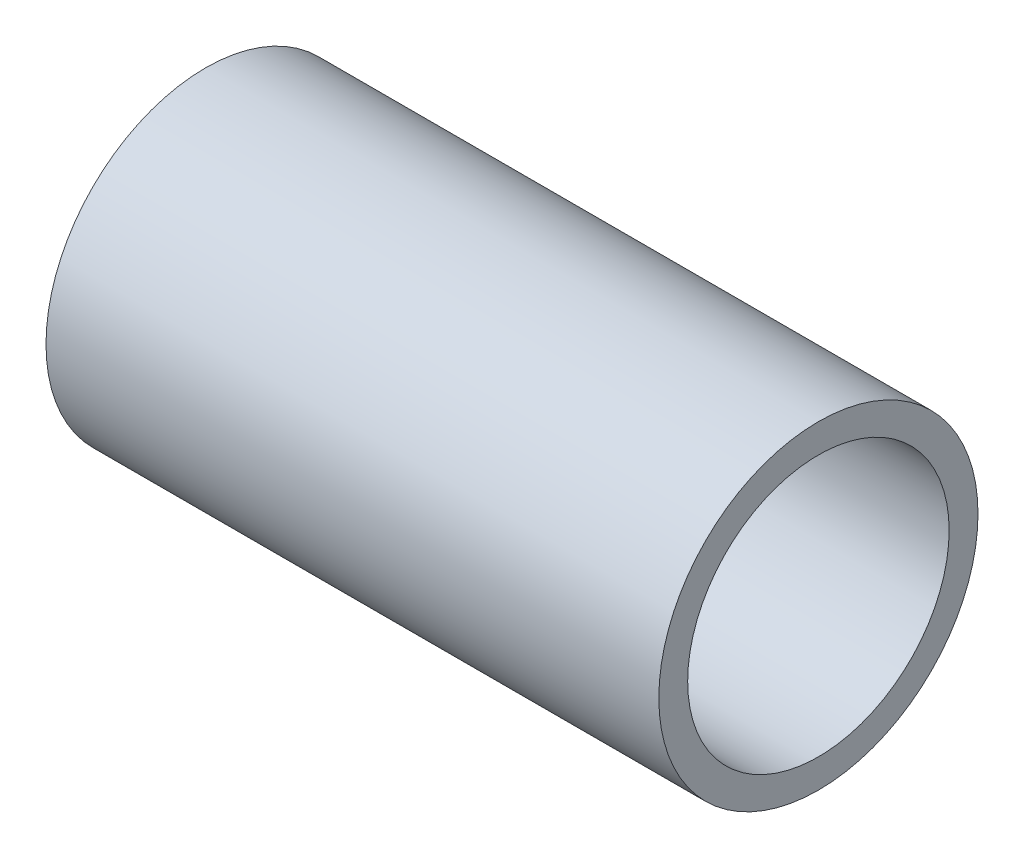
ISO-10303-21;
HEADER;
FILE_DESCRIPTION(('STEP AP214'),'2;1');
FILE_NAME('part.step','',(''),(''),'','','');
FILE_SCHEMA(('AUTOMOTIVE_DESIGN { 1 0 10303 214 1 1 1 1 }'));
ENDSEC;
DATA;
#1=APPLICATION_CONTEXT('core data for automotive mechanical design processes');
#2=APPLICATION_PROTOCOL_DEFINITION('international standard','automotive_design',2000,#1);
#3=PRODUCT_CONTEXT('',#1,'mechanical');
#4=PRODUCT('Part','Part','',(#3));
#5=PRODUCT_RELATED_PRODUCT_CATEGORY('part','',(#4));
#6=PRODUCT_DEFINITION_FORMATION('','',#4);
#7=PRODUCT_DEFINITION_CONTEXT('part definition',#1,'design');
#8=PRODUCT_DEFINITION('design','',#6,#7);
#9=PRODUCT_DEFINITION_SHAPE('','',#8);
#10=(LENGTH_UNIT() NAMED_UNIT(*) SI_UNIT(.MILLI.,.METRE.));
#11=(NAMED_UNIT(*) PLANE_ANGLE_UNIT() SI_UNIT($,.RADIAN.));
#12=(NAMED_UNIT(*) SI_UNIT($,.STERADIAN.) SOLID_ANGLE_UNIT());
#13=UNCERTAINTY_MEASURE_WITH_UNIT(LENGTH_MEASURE(1.E-05),#10,'distance_accuracy_value','');
#14=(GEOMETRIC_REPRESENTATION_CONTEXT(3) GLOBAL_UNCERTAINTY_ASSIGNED_CONTEXT((#13)) GLOBAL_UNIT_ASSIGNED_CONTEXT((#10,
#11,#12)) REPRESENTATION_CONTEXT('',''));
#15=CARTESIAN_POINT('',(0.,0.,0.));
#16=DIRECTION('',(0.,0.,1.));
#17=DIRECTION('',(1.,0.,0.));
#18=AXIS2_PLACEMENT_3D('',#15,#16,#17);
#19=CARTESIAN_POINT('',(7.62,0.,0.));
#20=DIRECTION('',(1.,0.,0.));
#21=DIRECTION('',(0.,0.,-1.));
#22=AXIS2_PLACEMENT_3D('',#19,#20,#21);
#23=PLANE('',#22);
#24=CARTESIAN_POINT('',(7.62,0.,0.));
#25=DIRECTION('',(1.,0.,0.));
#26=DIRECTION('',(0.,0.,-1.));
#27=AXIS2_PLACEMENT_3D('',#24,#25,#26);
#28=CIRCLE('',#27,1.984375);
#29=CARTESIAN_POINT('',(7.62,0.,1.984375));
#30=VERTEX_POINT('',#29);
#31=EDGE_CURVE('E10',#30,#30,#28,.T.);
#32=ORIENTED_EDGE('',*,*,#31,.T.);
#33=EDGE_LOOP('',(#32));
#34=FACE_BOUND('',#33,.T.);
#35=CARTESIAN_POINT('',(7.62,0.,0.));
#36=DIRECTION('',(1.,0.,0.));
#37=DIRECTION('',(0.,0.,-1.));
#38=AXIS2_PLACEMENT_3D('',#35,#36,#37);
#39=CIRCLE('',#38,1.6256);
#40=CARTESIAN_POINT('',(7.62,0.,1.6256));
#41=VERTEX_POINT('',#40);
#42=EDGE_CURVE('E46',#41,#41,#39,.T.);
#43=ORIENTED_EDGE('',*,*,#42,.F.);
#44=EDGE_LOOP('',(#43));
#45=FACE_BOUND('',#44,.T.);
#46=ADVANCED_FACE('F35',(#34,#45),#23,.T.);
#47=CARTESIAN_POINT('',(0.,0.,0.));
#48=DIRECTION('',(1.,0.,0.));
#49=DIRECTION('',(0.,0.,-1.));
#50=AXIS2_PLACEMENT_3D('',#47,#48,#49);
#51=PLANE('',#50);
#52=CARTESIAN_POINT('',(0.,0.,0.));
#53=DIRECTION('',(1.,0.,0.));
#54=DIRECTION('',(0.,0.,-1.));
#55=AXIS2_PLACEMENT_3D('',#52,#53,#54);
#56=CIRCLE('',#55,1.984375);
#57=CARTESIAN_POINT('',(0.,0.,1.984375));
#58=VERTEX_POINT('',#57);
#59=EDGE_CURVE('E39',#58,#58,#56,.T.);
#60=ORIENTED_EDGE('',*,*,#59,.F.);
#61=EDGE_LOOP('',(#60));
#62=FACE_BOUND('',#61,.T.);
#63=CARTESIAN_POINT('',(0.,0.,0.));
#64=DIRECTION('',(1.,0.,0.));
#65=DIRECTION('',(0.,0.,-1.));
#66=AXIS2_PLACEMENT_3D('',#63,#64,#65);
#67=CIRCLE('',#66,1.6256);
#68=CARTESIAN_POINT('',(0.,0.,1.6256));
#69=VERTEX_POINT('',#68);
#70=EDGE_CURVE('E48',#69,#69,#67,.T.);
#71=ORIENTED_EDGE('',*,*,#70,.T.);
#72=EDGE_LOOP('',(#71));
#73=FACE_BOUND('',#72,.T.);
#74=ADVANCED_FACE('F58',(#62,#73),#51,.F.);
#75=CARTESIAN_POINT('',(7.62,0.,0.));
#76=DIRECTION('',(-1.,0.,0.));
#77=DIRECTION('',(0.,0.,1.));
#78=AXIS2_PLACEMENT_3D('',#75,#76,#77);
#79=CYLINDRICAL_SURFACE('',#78,1.984375);
#80=CARTESIAN_POINT('',(7.62,0.,1.984375));
#81=CARTESIAN_POINT('',(7.540625,0.,1.984375));
#82=CARTESIAN_POINT('',(7.46125,0.,1.984375));
#83=CARTESIAN_POINT('',(7.3025,0.,1.984375));
#84=CARTESIAN_POINT('',(7.223125,0.,1.984375));
#85=CARTESIAN_POINT('',(7.064375,0.,1.984375));
#86=CARTESIAN_POINT('',(6.985,0.,1.984375));
#87=CARTESIAN_POINT('',(6.82625,0.,1.984375));
#88=CARTESIAN_POINT('',(6.746875,0.,1.984375));
#89=CARTESIAN_POINT('',(6.588125,0.,1.984375));
#90=CARTESIAN_POINT('',(6.50875,0.,1.984375));
#91=CARTESIAN_POINT('',(6.35,0.,1.984375));
#92=CARTESIAN_POINT('',(6.270625,0.,1.984375));
#93=CARTESIAN_POINT('',(6.111875,0.,1.984375));
#94=CARTESIAN_POINT('',(6.0325,0.,1.984375));
#95=CARTESIAN_POINT('',(5.87375,0.,1.984375));
#96=CARTESIAN_POINT('',(5.794375,0.,1.984375));
#97=CARTESIAN_POINT('',(5.635625,0.,1.984375));
#98=CARTESIAN_POINT('',(5.55625,0.,1.984375));
#99=CARTESIAN_POINT('',(5.3975,0.,1.984375));
#100=CARTESIAN_POINT('',(5.318125,0.,1.984375));
#101=CARTESIAN_POINT('',(5.159375,0.,1.984375));
#102=CARTESIAN_POINT('',(5.08,0.,1.984375));
#103=CARTESIAN_POINT('',(4.92125,0.,1.984375));
#104=CARTESIAN_POINT('',(4.841875,0.,1.984375));
#105=CARTESIAN_POINT('',(4.683125,0.,1.984375));
#106=CARTESIAN_POINT('',(4.60375,0.,1.984375));
#107=CARTESIAN_POINT('',(4.445,0.,1.984375));
#108=CARTESIAN_POINT('',(4.365625,0.,1.984375));
#109=CARTESIAN_POINT('',(4.206875,0.,1.984375));
#110=CARTESIAN_POINT('',(4.1275,0.,1.984375));
#111=CARTESIAN_POINT('',(3.96875,0.,1.984375));
#112=CARTESIAN_POINT('',(3.889375,0.,1.984375));
#113=CARTESIAN_POINT('',(3.730625,0.,1.984375));
#114=CARTESIAN_POINT('',(3.65125,0.,1.984375));
#115=CARTESIAN_POINT('',(3.4925,0.,1.984375));
#116=CARTESIAN_POINT('',(3.413125,0.,1.984375));
#117=CARTESIAN_POINT('',(3.254375,0.,1.984375));
#118=CARTESIAN_POINT('',(3.175,0.,1.984375));
#119=CARTESIAN_POINT('',(3.01625,0.,1.984375));
#120=CARTESIAN_POINT('',(2.936875,0.,1.984375));
#121=CARTESIAN_POINT('',(2.778125,0.,1.984375));
#122=CARTESIAN_POINT('',(2.69875,0.,1.984375));
#123=CARTESIAN_POINT('',(2.54,0.,1.984375));
#124=CARTESIAN_POINT('',(2.460625,0.,1.984375));
#125=CARTESIAN_POINT('',(2.301875,0.,1.984375));
#126=CARTESIAN_POINT('',(2.2225,0.,1.984375));
#127=CARTESIAN_POINT('',(2.06375,0.,1.984375));
#128=CARTESIAN_POINT('',(1.984375,0.,1.984375));
#129=CARTESIAN_POINT('',(1.825625,0.,1.984375));
#130=CARTESIAN_POINT('',(1.74625,0.,1.984375));
#131=CARTESIAN_POINT('',(1.5875,0.,1.984375));
#132=CARTESIAN_POINT('',(1.508125,0.,1.984375));
#133=CARTESIAN_POINT('',(1.349375,0.,1.984375));
#134=CARTESIAN_POINT('',(1.27,0.,1.984375));
#135=CARTESIAN_POINT('',(1.11125,0.,1.984375));
#136=CARTESIAN_POINT('',(1.031875,0.,1.984375));
#137=CARTESIAN_POINT('',(0.873125,0.,1.984375));
#138=CARTESIAN_POINT('',(0.79375,0.,1.984375));
#139=CARTESIAN_POINT('',(0.635,0.,1.984375));
#140=CARTESIAN_POINT('',(0.555625,0.,1.984375));
#141=CARTESIAN_POINT('',(0.396875,0.,1.984375));
#142=CARTESIAN_POINT('',(0.3175,0.,1.984375));
#143=CARTESIAN_POINT('',(0.15875,0.,1.984375));
#144=CARTESIAN_POINT('',(0.0793749999999999,0.,1.984375));
#145=CARTESIAN_POINT('',(0.,0.,1.984375));
#146=B_SPLINE_CURVE_WITH_KNOTS('',3,(#80,#81,#82,#83,#84,#85,#86,#87,#88,#89,#90,#91,#92,#93,
#94,#95,#96,#97,#98,#99,#100,#101,#102,#103,#104,#105,#106,#107,#108,#109,#110,#111,#112,#113,
#114,#115,#116,#117,#118,#119,#120,#121,#122,#123,#124,#125,#126,#127,#128,#129,#130,#131,#132,
#133,#134,#135,#136,#137,#138,#139,#140,#141,#142,#143,#144,#145),.UNSPECIFIED.,.F.,.F.,(4,2,2,
2,2,2,2,2,2,2,2,2,2,2,2,2,2,2,2,2,2,2,2,2,2,2,2,2,2,2,2,2,4),(0.,0.238125,0.476249999999999,
0.714375,0.952499999999999,1.190625,1.42875,1.666875,1.905,2.143125,2.38125,2.619375,2.8575,
3.095625,3.33375,3.571875,3.81,4.048125,4.28625,4.524375,4.7625,5.000625,5.23875,5.476875,5.715,
5.953125,6.19125,6.429375,6.6675,6.905625,7.14375,7.381875,7.62),.UNSPECIFIED.);
#147=EDGE_CURVE('BSEAM37',#30,#58,#146,.T.);
#148=ORIENTED_EDGE('',*,*,#31,.F.);
#149=ORIENTED_EDGE('',*,*,#59,.T.);
#150=ORIENTED_EDGE('',*,*,#147,.T.);
#151=ORIENTED_EDGE('',*,*,#147,.F.);
#152=EDGE_LOOP('',(#148,#150,#149,#151));
#153=FACE_BOUND('',#152,.T.);
#154=ADVANCED_FACE('F37',(#153),#79,.T.);
#155=CARTESIAN_POINT('',(7.62,0.,0.));
#156=DIRECTION('',(-1.,0.,0.));
#157=DIRECTION('',(0.,0.,1.));
#158=AXIS2_PLACEMENT_3D('',#155,#156,#157);
#159=CYLINDRICAL_SURFACE('',#158,1.6256);
#160=CARTESIAN_POINT('',(7.62,0.,1.6256));
#161=CARTESIAN_POINT('',(7.540625,0.,1.6256));
#162=CARTESIAN_POINT('',(7.46125,0.,1.6256));
#163=CARTESIAN_POINT('',(7.3025,0.,1.6256));
#164=CARTESIAN_POINT('',(7.223125,0.,1.6256));
#165=CARTESIAN_POINT('',(7.064375,0.,1.6256));
#166=CARTESIAN_POINT('',(6.985,0.,1.6256));
#167=CARTESIAN_POINT('',(6.82625,0.,1.6256));
#168=CARTESIAN_POINT('',(6.746875,0.,1.6256));
#169=CARTESIAN_POINT('',(6.588125,0.,1.6256));
#170=CARTESIAN_POINT('',(6.50875,0.,1.6256));
#171=CARTESIAN_POINT('',(6.35,0.,1.6256));
#172=CARTESIAN_POINT('',(6.270625,0.,1.6256));
#173=CARTESIAN_POINT('',(6.111875,0.,1.6256));
#174=CARTESIAN_POINT('',(6.0325,0.,1.6256));
#175=CARTESIAN_POINT('',(5.87375,0.,1.6256));
#176=CARTESIAN_POINT('',(5.794375,0.,1.6256));
#177=CARTESIAN_POINT('',(5.635625,0.,1.6256));
#178=CARTESIAN_POINT('',(5.55625,0.,1.6256));
#179=CARTESIAN_POINT('',(5.3975,0.,1.6256));
#180=CARTESIAN_POINT('',(5.318125,0.,1.6256));
#181=CARTESIAN_POINT('',(5.159375,0.,1.6256));
#182=CARTESIAN_POINT('',(5.08,0.,1.6256));
#183=CARTESIAN_POINT('',(4.92125,0.,1.6256));
#184=CARTESIAN_POINT('',(4.841875,0.,1.6256));
#185=CARTESIAN_POINT('',(4.683125,0.,1.6256));
#186=CARTESIAN_POINT('',(4.60375,0.,1.6256));
#187=CARTESIAN_POINT('',(4.445,0.,1.6256));
#188=CARTESIAN_POINT('',(4.365625,0.,1.6256));
#189=CARTESIAN_POINT('',(4.206875,0.,1.6256));
#190=CARTESIAN_POINT('',(4.1275,0.,1.6256));
#191=CARTESIAN_POINT('',(3.96875,0.,1.6256));
#192=CARTESIAN_POINT('',(3.889375,0.,1.6256));
#193=CARTESIAN_POINT('',(3.730625,0.,1.6256));
#194=CARTESIAN_POINT('',(3.65125,0.,1.6256));
#195=CARTESIAN_POINT('',(3.4925,0.,1.6256));
#196=CARTESIAN_POINT('',(3.413125,0.,1.6256));
#197=CARTESIAN_POINT('',(3.254375,0.,1.6256));
#198=CARTESIAN_POINT('',(3.175,0.,1.6256));
#199=CARTESIAN_POINT('',(3.01625,0.,1.6256));
#200=CARTESIAN_POINT('',(2.936875,0.,1.6256));
#201=CARTESIAN_POINT('',(2.778125,0.,1.6256));
#202=CARTESIAN_POINT('',(2.69875,0.,1.6256));
#203=CARTESIAN_POINT('',(2.54,0.,1.6256));
#204=CARTESIAN_POINT('',(2.460625,0.,1.6256));
#205=CARTESIAN_POINT('',(2.301875,0.,1.6256));
#206=CARTESIAN_POINT('',(2.2225,0.,1.6256));
#207=CARTESIAN_POINT('',(2.06375,0.,1.6256));
#208=CARTESIAN_POINT('',(1.984375,0.,1.6256));
#209=CARTESIAN_POINT('',(1.825625,0.,1.6256));
#210=CARTESIAN_POINT('',(1.74625,0.,1.6256));
#211=CARTESIAN_POINT('',(1.5875,0.,1.6256));
#212=CARTESIAN_POINT('',(1.508125,0.,1.6256));
#213=CARTESIAN_POINT('',(1.349375,0.,1.6256));
#214=CARTESIAN_POINT('',(1.27,0.,1.6256));
#215=CARTESIAN_POINT('',(1.11125,0.,1.6256));
#216=CARTESIAN_POINT('',(1.031875,0.,1.6256));
#217=CARTESIAN_POINT('',(0.873125,0.,1.6256));
#218=CARTESIAN_POINT('',(0.79375,0.,1.6256));
#219=CARTESIAN_POINT('',(0.635,0.,1.6256));
#220=CARTESIAN_POINT('',(0.555625,0.,1.6256));
#221=CARTESIAN_POINT('',(0.396875,0.,1.6256));
#222=CARTESIAN_POINT('',(0.3175,0.,1.6256));
#223=CARTESIAN_POINT('',(0.15875,0.,1.6256));
#224=CARTESIAN_POINT('',(0.0793749999999999,0.,1.6256));
#225=CARTESIAN_POINT('',(0.,0.,1.6256));
#226=B_SPLINE_CURVE_WITH_KNOTS('',3,(#160,#161,#162,#163,#164,#165,#166,#167,#168,#169,#170,
#171,#172,#173,#174,#175,#176,#177,#178,#179,#180,#181,#182,#183,#184,#185,#186,#187,#188,#189,
#190,#191,#192,#193,#194,#195,#196,#197,#198,#199,#200,#201,#202,#203,#204,#205,#206,#207,#208,
#209,#210,#211,#212,#213,#214,#215,#216,#217,#218,#219,#220,#221,#222,#223,#224,#225),
.UNSPECIFIED.,.F.,.F.,(4,2,2,2,2,2,2,2,2,2,2,2,2,2,2,2,2,2,2,2,2,2,2,2,2,2,2,2,2,2,2,2,4),(0.,
0.238125,0.476249999999999,0.714375,0.952499999999999,1.190625,1.42875,1.666875,1.905,2.143125,
2.38125,2.619375,2.8575,3.095625,3.33375,3.571875,3.81,4.048125,4.28625,4.524375,4.7625,
5.000625,5.23875,5.476875,5.715,5.953125,6.19125,6.429375,6.6675,6.905625,7.14375,7.381875,
7.62),.UNSPECIFIED.);
#227=EDGE_CURVE('BSEAM54',#41,#69,#226,.T.);
#228=ORIENTED_EDGE('',*,*,#42,.T.);
#229=ORIENTED_EDGE('',*,*,#70,.F.);
#230=ORIENTED_EDGE('',*,*,#227,.T.);
#231=ORIENTED_EDGE('',*,*,#227,.F.);
#232=EDGE_LOOP('',(#228,#230,#229,#231));
#233=FACE_BOUND('',#232,.T.);
#234=ADVANCED_FACE('F54',(#233),#159,.F.);
#235=CLOSED_SHELL('',(#46,#74,#154,#234));
#236=MANIFOLD_SOLID_BREP('B2',#235);
#237=ADVANCED_BREP_SHAPE_REPRESENTATION('',(#18,#236),#14);
#238=SHAPE_DEFINITION_REPRESENTATION(#9,#237);
ENDSEC;
END-ISO-10303-21;
